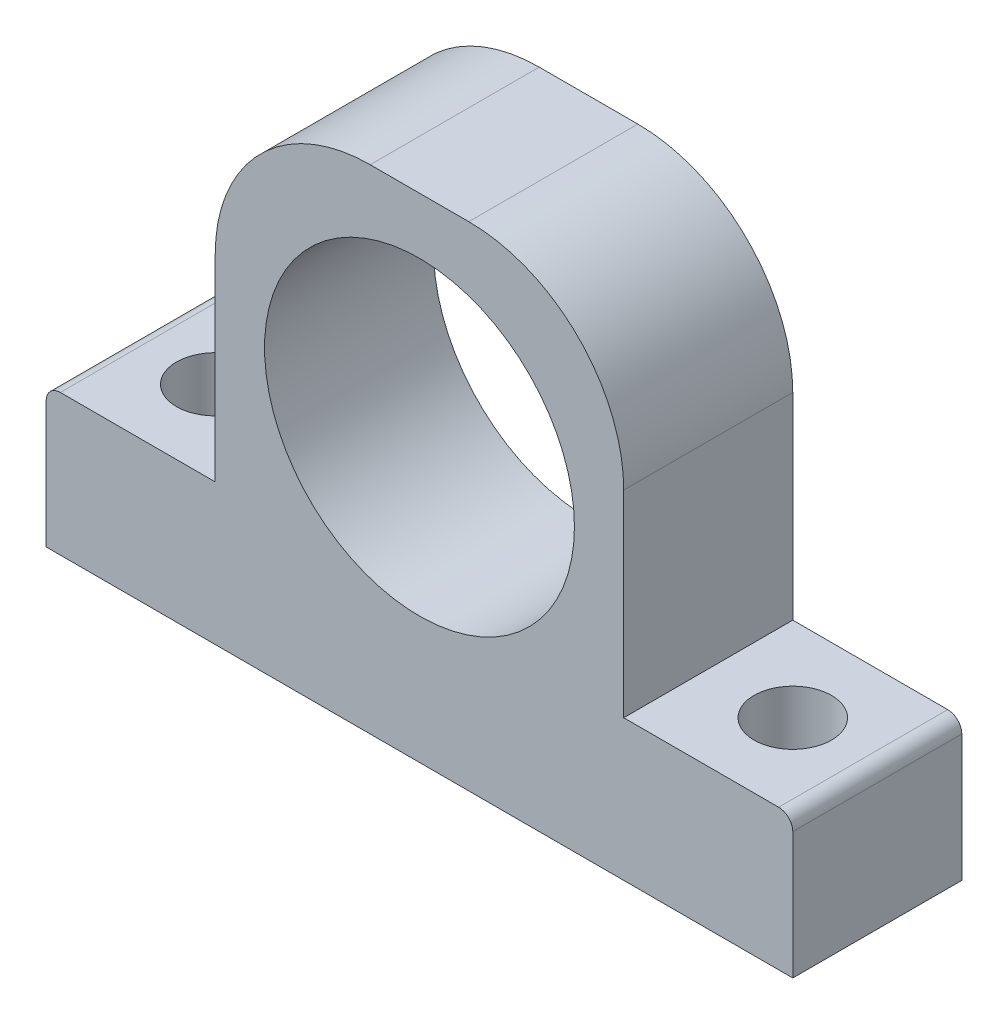
ISO-10303-21;
HEADER;
FILE_DESCRIPTION(('STEP AP214'),'2;1');
FILE_NAME('part.step','',(''),(''),'','','');
FILE_SCHEMA(('AUTOMOTIVE_DESIGN { 1 0 10303 214 1 1 1 1 }'));
ENDSEC;
DATA;
#1=APPLICATION_CONTEXT('core data for automotive mechanical design processes');
#2=APPLICATION_PROTOCOL_DEFINITION('international standard','automotive_design',2000,#1);
#3=PRODUCT_CONTEXT('',#1,'mechanical');
#4=PRODUCT('Part','Part','',(#3));
#5=PRODUCT_RELATED_PRODUCT_CATEGORY('part','',(#4));
#6=PRODUCT_DEFINITION_FORMATION('','',#4);
#7=PRODUCT_DEFINITION_CONTEXT('part definition',#1,'design');
#8=PRODUCT_DEFINITION('design','',#6,#7);
#9=PRODUCT_DEFINITION_SHAPE('','',#8);
#10=(LENGTH_UNIT() NAMED_UNIT(*) SI_UNIT(.MILLI.,.METRE.));
#11=(NAMED_UNIT(*) PLANE_ANGLE_UNIT() SI_UNIT($,.RADIAN.));
#12=(NAMED_UNIT(*) SI_UNIT($,.STERADIAN.) SOLID_ANGLE_UNIT());
#13=UNCERTAINTY_MEASURE_WITH_UNIT(LENGTH_MEASURE(1.E-05),#10,'distance_accuracy_value','');
#14=(GEOMETRIC_REPRESENTATION_CONTEXT(3) GLOBAL_UNCERTAINTY_ASSIGNED_CONTEXT((#13)) GLOBAL_UNIT_ASSIGNED_CONTEXT((#10,
#11,#12)) REPRESENTATION_CONTEXT('',''));
#15=CARTESIAN_POINT('',(0.,0.,0.));
#16=DIRECTION('',(0.,0.,1.));
#17=DIRECTION('',(1.,0.,0.));
#18=AXIS2_PLACEMENT_3D('',#15,#16,#17);
#19=CARTESIAN_POINT('',(-25.5,9.,12.));
#20=DIRECTION('',(0.,0.,1.));
#21=DIRECTION('',(1.,0.,0.));
#22=AXIS2_PLACEMENT_3D('',#19,#20,#21);
#23=PLANE('',#22);
#24=DIRECTION('',(0.,1.,0.));
#25=VECTOR('',#24,1.);
#26=CARTESIAN_POINT('',(26.5,9.,12.));
#27=LINE('',#26,#25);
#28=CARTESIAN_POINT('',(26.5,0.,12.));
#29=VERTEX_POINT('',#28);
#30=CARTESIAN_POINT('',(26.5,9.,12.));
#31=VERTEX_POINT('',#30);
#32=EDGE_CURVE('E185',#29,#31,#27,.T.);
#33=ORIENTED_EDGE('',*,*,#32,.T.);
#34=CARTESIAN_POINT('',(25.5,9.00000000000001,12.));
#35=DIRECTION('',(0.,0.,1.));
#36=DIRECTION('',(-1.,0.,0.));
#37=AXIS2_PLACEMENT_3D('',#34,#35,#36);
#38=CIRCLE('',#37,1.);
#39=CARTESIAN_POINT('',(25.5,10.,12.));
#40=VERTEX_POINT('',#39);
#41=EDGE_CURVE('E113',#31,#40,#38,.T.);
#42=ORIENTED_EDGE('',*,*,#41,.T.);
#43=DIRECTION('',(-1.,0.,0.));
#44=VECTOR('',#43,1.);
#45=CARTESIAN_POINT('',(14.5,10.,12.));
#46=LINE('',#45,#44);
#47=CARTESIAN_POINT('',(14.5,10.,12.));
#48=VERTEX_POINT('',#47);
#49=EDGE_CURVE('E212',#40,#48,#46,.T.);
#50=ORIENTED_EDGE('',*,*,#49,.T.);
#51=DIRECTION('',(0.,1.,0.));
#52=VECTOR('',#51,1.);
#53=CARTESIAN_POINT('',(14.5,23.9999999999999,12.));
#54=LINE('',#53,#52);
#55=CARTESIAN_POINT('',(14.5,23.9999999999999,12.));
#56=VERTEX_POINT('',#55);
#57=EDGE_CURVE('E231',#48,#56,#54,.T.);
#58=ORIENTED_EDGE('',*,*,#57,.T.);
#59=CARTESIAN_POINT('',(3.5,24.,12.));
#60=DIRECTION('',(0.,0.,1.));
#61=DIRECTION('',(-1.,0.,0.));
#62=AXIS2_PLACEMENT_3D('',#59,#60,#61);
#63=CIRCLE('',#62,11.);
#64=CARTESIAN_POINT('',(3.49999999999991,35.,12.));
#65=VERTEX_POINT('',#64);
#66=EDGE_CURVE('E228',#56,#65,#63,.T.);
#67=ORIENTED_EDGE('',*,*,#66,.T.);
#68=DIRECTION('',(-1.,0.,0.));
#69=VECTOR('',#68,1.);
#70=CARTESIAN_POINT('',(-3.49999999999993,35.,12.));
#71=LINE('',#70,#69);
#72=CARTESIAN_POINT('',(-3.49999999999993,35.,12.));
#73=VERTEX_POINT('',#72);
#74=EDGE_CURVE('E230',#65,#73,#71,.T.);
#75=ORIENTED_EDGE('',*,*,#74,.T.);
#76=CARTESIAN_POINT('',(-3.50000000000001,24.,12.));
#77=DIRECTION('',(0.,0.,1.));
#78=DIRECTION('',(1.,0.,0.));
#79=AXIS2_PLACEMENT_3D('',#76,#77,#78);
#80=CIRCLE('',#79,11.);
#81=CARTESIAN_POINT('',(-14.5,23.9999999999999,12.));
#82=VERTEX_POINT('',#81);
#83=EDGE_CURVE('E233',#73,#82,#80,.T.);
#84=ORIENTED_EDGE('',*,*,#83,.T.);
#85=DIRECTION('',(0.,-1.,0.));
#86=VECTOR('',#85,1.);
#87=CARTESIAN_POINT('',(-14.5,23.9999999999999,12.));
#88=LINE('',#87,#86);
#89=CARTESIAN_POINT('',(-14.5,10.,12.));
#90=VERTEX_POINT('',#89);
#91=EDGE_CURVE('E239',#82,#90,#88,.T.);
#92=ORIENTED_EDGE('',*,*,#91,.T.);
#93=DIRECTION('',(-1.,0.,0.));
#94=VECTOR('',#93,1.);
#95=CARTESIAN_POINT('',(-25.5,10.,12.));
#96=LINE('',#95,#94);
#97=CARTESIAN_POINT('',(-25.5,10.,12.));
#98=VERTEX_POINT('',#97);
#99=EDGE_CURVE('E144',#90,#98,#96,.T.);
#100=ORIENTED_EDGE('',*,*,#99,.T.);
#101=CARTESIAN_POINT('',(-25.5,9.,12.));
#102=DIRECTION('',(0.,0.,1.));
#103=DIRECTION('',(1.,0.,0.));
#104=AXIS2_PLACEMENT_3D('',#101,#102,#103);
#105=CIRCLE('',#104,1.);
#106=CARTESIAN_POINT('',(-26.5,8.99999999999999,12.));
#107=VERTEX_POINT('',#106);
#108=EDGE_CURVE('E138',#98,#107,#105,.T.);
#109=ORIENTED_EDGE('',*,*,#108,.T.);
#110=DIRECTION('',(0.,-1.,0.));
#111=VECTOR('',#110,1.);
#112=CARTESIAN_POINT('',(-26.5,8.99999999999999,12.));
#113=LINE('',#112,#111);
#114=CARTESIAN_POINT('',(-26.5,0.,12.));
#115=VERTEX_POINT('',#114);
#116=EDGE_CURVE('E142',#107,#115,#113,.T.);
#117=ORIENTED_EDGE('',*,*,#116,.T.);
#118=DIRECTION('',(1.,0.,0.));
#119=VECTOR('',#118,1.);
#120=CARTESIAN_POINT('',(-26.5,0.,12.));
#121=LINE('',#120,#119);
#122=EDGE_CURVE('E58',#115,#29,#121,.T.);
#123=ORIENTED_EDGE('',*,*,#122,.T.);
#124=EDGE_LOOP('',(#33,#42,#50,#58,#67,#75,#84,#92,#100,#109,#117,#123));
#125=FACE_BOUND('',#124,.T.);
#126=CARTESIAN_POINT('',(0.,20.,12.));
#127=DIRECTION('',(0.,0.,1.));
#128=DIRECTION('',(1.,0.,0.));
#129=AXIS2_PLACEMENT_3D('',#126,#127,#128);
#130=CIRCLE('',#129,11.);
#131=CARTESIAN_POINT('',(11.,20.,12.));
#132=VERTEX_POINT('',#131);
#133=EDGE_CURVE('E166',#132,#132,#130,.T.);
#134=ORIENTED_EDGE('',*,*,#133,.F.);
#135=EDGE_LOOP('',(#134));
#136=FACE_BOUND('',#135,.T.);
#137=ADVANCED_FACE('F41',(#125,#136),#23,.T.);
#138=CARTESIAN_POINT('',(-25.5,9.,0.));
#139=DIRECTION('',(0.,0.,1.));
#140=DIRECTION('',(1.,0.,0.));
#141=AXIS2_PLACEMENT_3D('',#138,#139,#140);
#142=PLANE('',#141);
#143=DIRECTION('',(0.,1.,0.));
#144=VECTOR('',#143,1.);
#145=CARTESIAN_POINT('',(26.5,9.,0.));
#146=LINE('',#145,#144);
#147=CARTESIAN_POINT('',(26.5,0.,0.));
#148=VERTEX_POINT('',#147);
#149=CARTESIAN_POINT('',(26.5,9.,0.));
#150=VERTEX_POINT('',#149);
#151=EDGE_CURVE('E162',#148,#150,#146,.T.);
#152=ORIENTED_EDGE('',*,*,#151,.F.);
#153=DIRECTION('',(1.,0.,0.));
#154=VECTOR('',#153,1.);
#155=CARTESIAN_POINT('',(-26.5,0.,0.));
#156=LINE('',#155,#154);
#157=CARTESIAN_POINT('',(-26.5,0.,0.));
#158=VERTEX_POINT('',#157);
#159=EDGE_CURVE('E105',#158,#148,#156,.T.);
#160=ORIENTED_EDGE('',*,*,#159,.F.);
#161=DIRECTION('',(0.,-1.,0.));
#162=VECTOR('',#161,1.);
#163=CARTESIAN_POINT('',(-26.5,8.99999999999999,0.));
#164=LINE('',#163,#162);
#165=CARTESIAN_POINT('',(-26.5,8.99999999999999,0.));
#166=VERTEX_POINT('',#165);
#167=EDGE_CURVE('E99',#166,#158,#164,.T.);
#168=ORIENTED_EDGE('',*,*,#167,.F.);
#169=CARTESIAN_POINT('',(-25.5,9.,0.));
#170=DIRECTION('',(0.,0.,1.));
#171=DIRECTION('',(1.,0.,0.));
#172=AXIS2_PLACEMENT_3D('',#169,#170,#171);
#173=CIRCLE('',#172,1.);
#174=CARTESIAN_POINT('',(-25.5,10.,0.));
#175=VERTEX_POINT('',#174);
#176=EDGE_CURVE('E152',#175,#166,#173,.T.);
#177=ORIENTED_EDGE('',*,*,#176,.F.);
#178=DIRECTION('',(-1.,0.,0.));
#179=VECTOR('',#178,1.);
#180=CARTESIAN_POINT('',(-25.5,10.,0.));
#181=LINE('',#180,#179);
#182=CARTESIAN_POINT('',(-14.5,10.,0.));
#183=VERTEX_POINT('',#182);
#184=EDGE_CURVE('E180',#183,#175,#181,.T.);
#185=ORIENTED_EDGE('',*,*,#184,.F.);
#186=DIRECTION('',(0.,-1.,0.));
#187=VECTOR('',#186,1.);
#188=CARTESIAN_POINT('',(-14.5,23.9999999999999,0.));
#189=LINE('',#188,#187);
#190=CARTESIAN_POINT('',(-14.5,23.9999999999999,0.));
#191=VERTEX_POINT('',#190);
#192=EDGE_CURVE('E178',#191,#183,#189,.T.);
#193=ORIENTED_EDGE('',*,*,#192,.F.);
#194=CARTESIAN_POINT('',(-3.50000000000001,24.,0.));
#195=DIRECTION('',(0.,0.,1.));
#196=DIRECTION('',(1.,0.,0.));
#197=AXIS2_PLACEMENT_3D('',#194,#195,#196);
#198=CIRCLE('',#197,11.);
#199=CARTESIAN_POINT('',(-3.49999999999993,35.,0.));
#200=VERTEX_POINT('',#199);
#201=EDGE_CURVE('E176',#200,#191,#198,.T.);
#202=ORIENTED_EDGE('',*,*,#201,.F.);
#203=DIRECTION('',(-1.,0.,0.));
#204=VECTOR('',#203,1.);
#205=CARTESIAN_POINT('',(-3.49999999999993,35.,0.));
#206=LINE('',#205,#204);
#207=CARTESIAN_POINT('',(3.49999999999991,35.,0.));
#208=VERTEX_POINT('',#207);
#209=EDGE_CURVE('E174',#208,#200,#206,.T.);
#210=ORIENTED_EDGE('',*,*,#209,.F.);
#211=CARTESIAN_POINT('',(3.5,24.,0.));
#212=DIRECTION('',(0.,0.,1.));
#213=DIRECTION('',(-1.,0.,0.));
#214=AXIS2_PLACEMENT_3D('',#211,#212,#213);
#215=CIRCLE('',#214,11.);
#216=CARTESIAN_POINT('',(14.5,23.9999999999999,0.));
#217=VERTEX_POINT('',#216);
#218=EDGE_CURVE('E172',#217,#208,#215,.T.);
#219=ORIENTED_EDGE('',*,*,#218,.F.);
#220=DIRECTION('',(0.,1.,0.));
#221=VECTOR('',#220,1.);
#222=CARTESIAN_POINT('',(14.5,23.9999999999999,0.));
#223=LINE('',#222,#221);
#224=CARTESIAN_POINT('',(14.5,10.,0.));
#225=VERTEX_POINT('',#224);
#226=EDGE_CURVE('E170',#225,#217,#223,.T.);
#227=ORIENTED_EDGE('',*,*,#226,.F.);
#228=DIRECTION('',(-1.,0.,0.));
#229=VECTOR('',#228,1.);
#230=CARTESIAN_POINT('',(14.5,10.,0.));
#231=LINE('',#230,#229);
#232=CARTESIAN_POINT('',(25.5,10.,0.));
#233=VERTEX_POINT('',#232);
#234=EDGE_CURVE('E168',#233,#225,#231,.T.);
#235=ORIENTED_EDGE('',*,*,#234,.F.);
#236=CARTESIAN_POINT('',(25.5,9.00000000000001,0.));
#237=DIRECTION('',(0.,0.,1.));
#238=DIRECTION('',(-1.,0.,0.));
#239=AXIS2_PLACEMENT_3D('',#236,#237,#238);
#240=CIRCLE('',#239,1.);
#241=EDGE_CURVE('E165',#150,#233,#240,.T.);
#242=ORIENTED_EDGE('',*,*,#241,.F.);
#243=EDGE_LOOP('',(#152,#160,#168,#177,#185,#193,#202,#210,#219,#227,#235,#242));
#244=FACE_BOUND('',#243,.T.);
#245=CARTESIAN_POINT('',(0.,20.,0.));
#246=DIRECTION('',(0.,0.,1.));
#247=DIRECTION('',(1.,0.,0.));
#248=AXIS2_PLACEMENT_3D('',#245,#246,#247);
#249=CIRCLE('',#248,11.);
#250=CARTESIAN_POINT('',(11.,20.,0.));
#251=VERTEX_POINT('',#250);
#252=EDGE_CURVE('E293',#251,#251,#249,.T.);
#253=ORIENTED_EDGE('',*,*,#252,.T.);
#254=EDGE_LOOP('',(#253));
#255=FACE_BOUND('',#254,.T.);
#256=ADVANCED_FACE('F216',(#244,#255),#142,.F.);
#257=CARTESIAN_POINT('',(26.5,9.,12.));
#258=DIRECTION('',(-1.,0.,0.));
#259=DIRECTION('',(0.,0.,1.));
#260=AXIS2_PLACEMENT_3D('',#257,#258,#259);
#261=PLANE('',#260);
#262=ORIENTED_EDGE('',*,*,#151,.T.);
#263=DIRECTION('',(0.,0.,-1.));
#264=VECTOR('',#263,1.);
#265=CARTESIAN_POINT('',(26.5,9.,12.));
#266=LINE('',#265,#264);
#267=EDGE_CURVE('E11',#31,#150,#266,.T.);
#268=ORIENTED_EDGE('',*,*,#267,.F.);
#269=ORIENTED_EDGE('',*,*,#32,.F.);
#270=DIRECTION('',(0.,0.,-1.));
#271=VECTOR('',#270,1.);
#272=CARTESIAN_POINT('',(26.5,0.,12.));
#273=LINE('',#272,#271);
#274=EDGE_CURVE('E158',#29,#148,#273,.T.);
#275=ORIENTED_EDGE('',*,*,#274,.T.);
#276=EDGE_LOOP('',(#262,#268,#269,#275));
#277=FACE_BOUND('',#276,.T.);
#278=ADVANCED_FACE('F43',(#277),#261,.F.);
#279=CARTESIAN_POINT('',(25.5,9.00000000000001,12.));
#280=DIRECTION('',(0.,0.,-1.));
#281=DIRECTION('',(-1.,0.,0.));
#282=AXIS2_PLACEMENT_3D('',#279,#280,#281);
#283=CYLINDRICAL_SURFACE('',#282,1.);
#284=ORIENTED_EDGE('',*,*,#241,.T.);
#285=DIRECTION('',(0.,0.,-1.));
#286=VECTOR('',#285,1.);
#287=CARTESIAN_POINT('',(25.5,10.,12.));
#288=LINE('',#287,#286);
#289=EDGE_CURVE('E50',#40,#233,#288,.T.);
#290=ORIENTED_EDGE('',*,*,#289,.F.);
#291=ORIENTED_EDGE('',*,*,#41,.F.);
#292=ORIENTED_EDGE('',*,*,#267,.T.);
#293=EDGE_LOOP('',(#284,#290,#291,#292));
#294=FACE_BOUND('',#293,.T.);
#295=ADVANCED_FACE('F314',(#294),#283,.T.);
#296=CARTESIAN_POINT('',(14.5,10.,12.));
#297=DIRECTION('',(0.,-1.,0.));
#298=DIRECTION('',(1.,0.,0.));
#299=AXIS2_PLACEMENT_3D('',#296,#297,#298);
#300=PLANE('',#299);
#301=CARTESIAN_POINT('',(20.5,10.,6.));
#302=DIRECTION('',(0.,1.,0.));
#303=DIRECTION('',(1.,0.,0.));
#304=AXIS2_PLACEMENT_3D('',#301,#302,#303);
#305=CIRCLE('',#304,2.75);
#306=CARTESIAN_POINT('',(23.25,10.,6.));
#307=VERTEX_POINT('',#306);
#308=EDGE_CURVE('E291',#307,#307,#305,.T.);
#309=ORIENTED_EDGE('',*,*,#308,.F.);
#310=EDGE_LOOP('',(#309));
#311=FACE_BOUND('',#310,.T.);
#312=ORIENTED_EDGE('',*,*,#234,.T.);
#313=DIRECTION('',(0.,0.,-1.));
#314=VECTOR('',#313,1.);
#315=CARTESIAN_POINT('',(14.5,10.,12.));
#316=LINE('',#315,#314);
#317=EDGE_CURVE('E204',#48,#225,#316,.T.);
#318=ORIENTED_EDGE('',*,*,#317,.F.);
#319=ORIENTED_EDGE('',*,*,#49,.F.);
#320=ORIENTED_EDGE('',*,*,#289,.T.);
#321=EDGE_LOOP('',(#312,#318,#319,#320));
#322=FACE_BOUND('',#321,.T.);
#323=ADVANCED_FACE('F210',(#311,#322),#300,.F.);
#324=CARTESIAN_POINT('',(14.5,23.9999999999999,12.));
#325=DIRECTION('',(-1.,0.,0.));
#326=DIRECTION('',(0.,-1.,0.));
#327=AXIS2_PLACEMENT_3D('',#324,#325,#326);
#328=PLANE('',#327);
#329=ORIENTED_EDGE('',*,*,#226,.T.);
#330=DIRECTION('',(0.,0.,-1.));
#331=VECTOR('',#330,1.);
#332=CARTESIAN_POINT('',(14.5,23.9999999999999,12.));
#333=LINE('',#332,#331);
#334=EDGE_CURVE('E201',#56,#217,#333,.T.);
#335=ORIENTED_EDGE('',*,*,#334,.F.);
#336=ORIENTED_EDGE('',*,*,#57,.F.);
#337=ORIENTED_EDGE('',*,*,#317,.T.);
#338=EDGE_LOOP('',(#329,#335,#336,#337));
#339=FACE_BOUND('',#338,.T.);
#340=ADVANCED_FACE('F222',(#339),#328,.F.);
#341=CARTESIAN_POINT('',(3.5,24.,12.));
#342=DIRECTION('',(0.,0.,-1.));
#343=DIRECTION('',(-1.,0.,0.));
#344=AXIS2_PLACEMENT_3D('',#341,#342,#343);
#345=CYLINDRICAL_SURFACE('',#344,11.);
#346=ORIENTED_EDGE('',*,*,#218,.T.);
#347=DIRECTION('',(0.,0.,-1.));
#348=VECTOR('',#347,1.);
#349=CARTESIAN_POINT('',(3.49999999999991,35.,12.));
#350=LINE('',#349,#348);
#351=EDGE_CURVE('E198',#65,#208,#350,.T.);
#352=ORIENTED_EDGE('',*,*,#351,.F.);
#353=ORIENTED_EDGE('',*,*,#66,.F.);
#354=ORIENTED_EDGE('',*,*,#334,.T.);
#355=EDGE_LOOP('',(#346,#352,#353,#354));
#356=FACE_BOUND('',#355,.T.);
#357=ADVANCED_FACE('F226',(#356),#345,.T.);
#358=CARTESIAN_POINT('',(-3.49999999999993,35.,12.));
#359=DIRECTION('',(0.,-1.,0.));
#360=DIRECTION('',(0.,0.,-1.));
#361=AXIS2_PLACEMENT_3D('',#358,#359,#360);
#362=PLANE('',#361);
#363=ORIENTED_EDGE('',*,*,#209,.T.);
#364=DIRECTION('',(0.,0.,-1.));
#365=VECTOR('',#364,1.);
#366=CARTESIAN_POINT('',(-3.49999999999993,35.,12.));
#367=LINE('',#366,#365);
#368=EDGE_CURVE('E195',#73,#200,#367,.T.);
#369=ORIENTED_EDGE('',*,*,#368,.F.);
#370=ORIENTED_EDGE('',*,*,#74,.F.);
#371=ORIENTED_EDGE('',*,*,#351,.T.);
#372=EDGE_LOOP('',(#363,#369,#370,#371));
#373=FACE_BOUND('',#372,.T.);
#374=ADVANCED_FACE('F324',(#373),#362,.F.);
#375=CARTESIAN_POINT('',(-3.50000000000001,24.,12.));
#376=DIRECTION('',(0.,0.,-1.));
#377=DIRECTION('',(-1.,0.,0.));
#378=AXIS2_PLACEMENT_3D('',#375,#376,#377);
#379=CYLINDRICAL_SURFACE('',#378,11.);
#380=ORIENTED_EDGE('',*,*,#201,.T.);
#381=DIRECTION('',(0.,0.,-1.));
#382=VECTOR('',#381,1.);
#383=CARTESIAN_POINT('',(-14.5,23.9999999999999,12.));
#384=LINE('',#383,#382);
#385=EDGE_CURVE('E192',#82,#191,#384,.T.);
#386=ORIENTED_EDGE('',*,*,#385,.F.);
#387=ORIENTED_EDGE('',*,*,#83,.F.);
#388=ORIENTED_EDGE('',*,*,#368,.T.);
#389=EDGE_LOOP('',(#380,#386,#387,#388));
#390=FACE_BOUND('',#389,.T.);
#391=ADVANCED_FACE('F327',(#390),#379,.T.);
#392=CARTESIAN_POINT('',(-14.5,23.9999999999999,12.));
#393=DIRECTION('',(1.,0.,0.));
#394=DIRECTION('',(0.,1.,0.));
#395=AXIS2_PLACEMENT_3D('',#392,#393,#394);
#396=PLANE('',#395);
#397=ORIENTED_EDGE('',*,*,#192,.T.);
#398=DIRECTION('',(0.,0.,-1.));
#399=VECTOR('',#398,1.);
#400=CARTESIAN_POINT('',(-14.5,10.,12.));
#401=LINE('',#400,#399);
#402=EDGE_CURVE('E189',#90,#183,#401,.T.);
#403=ORIENTED_EDGE('',*,*,#402,.F.);
#404=ORIENTED_EDGE('',*,*,#91,.F.);
#405=ORIENTED_EDGE('',*,*,#385,.T.);
#406=EDGE_LOOP('',(#397,#403,#404,#405));
#407=FACE_BOUND('',#406,.T.);
#408=ADVANCED_FACE('F245',(#407),#396,.F.);
#409=CARTESIAN_POINT('',(-25.5,10.,12.));
#410=DIRECTION('',(0.,-1.,0.));
#411=DIRECTION('',(1.,0.,0.));
#412=AXIS2_PLACEMENT_3D('',#409,#410,#411);
#413=PLANE('',#412);
#414=CARTESIAN_POINT('',(-20.5,10.,6.));
#415=DIRECTION('',(0.,1.,0.));
#416=DIRECTION('',(-1.,0.,0.));
#417=AXIS2_PLACEMENT_3D('',#414,#415,#416);
#418=CIRCLE('',#417,2.75);
#419=CARTESIAN_POINT('',(-23.25,10.,6.));
#420=VERTEX_POINT('',#419);
#421=EDGE_CURVE('E289',#420,#420,#418,.T.);
#422=ORIENTED_EDGE('',*,*,#421,.F.);
#423=EDGE_LOOP('',(#422));
#424=FACE_BOUND('',#423,.T.);
#425=ORIENTED_EDGE('',*,*,#184,.T.);
#426=DIRECTION('',(0.,0.,-1.));
#427=VECTOR('',#426,1.);
#428=CARTESIAN_POINT('',(-25.5,10.,12.));
#429=LINE('',#428,#427);
#430=EDGE_CURVE('E153',#98,#175,#429,.T.);
#431=ORIENTED_EDGE('',*,*,#430,.F.);
#432=ORIENTED_EDGE('',*,*,#99,.F.);
#433=ORIENTED_EDGE('',*,*,#402,.T.);
#434=EDGE_LOOP('',(#425,#431,#432,#433));
#435=FACE_BOUND('',#434,.T.);
#436=ADVANCED_FACE('F249',(#424,#435),#413,.F.);
#437=CARTESIAN_POINT('',(-25.5,9.,12.));
#438=DIRECTION('',(0.,0.,-1.));
#439=DIRECTION('',(-1.,0.,0.));
#440=AXIS2_PLACEMENT_3D('',#437,#438,#439);
#441=CYLINDRICAL_SURFACE('',#440,1.);
#442=ORIENTED_EDGE('',*,*,#176,.T.);
#443=DIRECTION('',(0.,0.,-1.));
#444=VECTOR('',#443,1.);
#445=CARTESIAN_POINT('',(-26.5,8.99999999999999,12.));
#446=LINE('',#445,#444);
#447=EDGE_CURVE('E149',#107,#166,#446,.T.);
#448=ORIENTED_EDGE('',*,*,#447,.F.);
#449=ORIENTED_EDGE('',*,*,#108,.F.);
#450=ORIENTED_EDGE('',*,*,#430,.T.);
#451=EDGE_LOOP('',(#442,#448,#449,#450));
#452=FACE_BOUND('',#451,.T.);
#453=ADVANCED_FACE('F150',(#452),#441,.T.);
#454=CARTESIAN_POINT('',(-26.5,8.99999999999999,12.));
#455=DIRECTION('',(1.,0.,0.));
#456=DIRECTION('',(0.,1.,0.));
#457=AXIS2_PLACEMENT_3D('',#454,#455,#456);
#458=PLANE('',#457);
#459=ORIENTED_EDGE('',*,*,#167,.T.);
#460=DIRECTION('',(0.,0.,-1.));
#461=VECTOR('',#460,1.);
#462=CARTESIAN_POINT('',(-26.5,0.,12.));
#463=LINE('',#462,#461);
#464=EDGE_CURVE('E154',#115,#158,#463,.T.);
#465=ORIENTED_EDGE('',*,*,#464,.F.);
#466=ORIENTED_EDGE('',*,*,#116,.F.);
#467=ORIENTED_EDGE('',*,*,#447,.T.);
#468=EDGE_LOOP('',(#459,#465,#466,#467));
#469=FACE_BOUND('',#468,.T.);
#470=ADVANCED_FACE('F156',(#469),#458,.F.);
#471=CARTESIAN_POINT('',(-26.5,0.,12.));
#472=DIRECTION('',(0.,1.,0.));
#473=DIRECTION('',(-1.,0.,0.));
#474=AXIS2_PLACEMENT_3D('',#471,#472,#473);
#475=PLANE('',#474);
#476=CARTESIAN_POINT('',(-20.5,0.,6.));
#477=DIRECTION('',(0.,1.,0.));
#478=DIRECTION('',(-1.,0.,0.));
#479=AXIS2_PLACEMENT_3D('',#476,#477,#478);
#480=CIRCLE('',#479,2.75);
#481=CARTESIAN_POINT('',(-23.25,0.,6.));
#482=VERTEX_POINT('',#481);
#483=EDGE_CURVE('E286',#482,#482,#480,.T.);
#484=ORIENTED_EDGE('',*,*,#483,.T.);
#485=EDGE_LOOP('',(#484));
#486=FACE_BOUND('',#485,.T.);
#487=CARTESIAN_POINT('',(20.5,0.,6.));
#488=DIRECTION('',(0.,1.,0.));
#489=DIRECTION('',(1.,0.,0.));
#490=AXIS2_PLACEMENT_3D('',#487,#488,#489);
#491=CIRCLE('',#490,2.75);
#492=CARTESIAN_POINT('',(23.25,0.,6.));
#493=VERTEX_POINT('',#492);
#494=EDGE_CURVE('E296',#493,#493,#491,.T.);
#495=ORIENTED_EDGE('',*,*,#494,.T.);
#496=EDGE_LOOP('',(#495));
#497=FACE_BOUND('',#496,.T.);
#498=ORIENTED_EDGE('',*,*,#159,.T.);
#499=ORIENTED_EDGE('',*,*,#274,.F.);
#500=ORIENTED_EDGE('',*,*,#122,.F.);
#501=ORIENTED_EDGE('',*,*,#464,.T.);
#502=EDGE_LOOP('',(#498,#499,#500,#501));
#503=FACE_BOUND('',#502,.T.);
#504=ADVANCED_FACE('F253',(#486,#497,#503),#475,.F.);
#505=CARTESIAN_POINT('',(0.,20.,12.));
#506=DIRECTION('',(0.,0.,-1.));
#507=DIRECTION('',(-1.,0.,0.));
#508=AXIS2_PLACEMENT_3D('',#505,#506,#507);
#509=CYLINDRICAL_SURFACE('',#508,11.);
#510=ORIENTED_EDGE('',*,*,#133,.T.);
#511=EDGE_LOOP('',(#510));
#512=FACE_BOUND('',#511,.T.);
#513=ORIENTED_EDGE('',*,*,#252,.F.);
#514=EDGE_LOOP('',(#513));
#515=FACE_BOUND('',#514,.T.);
#516=ADVANCED_FACE('F255',(#512,#515),#509,.F.);
#517=CARTESIAN_POINT('',(20.5,0.,6.));
#518=DIRECTION('',(0.,1.,0.));
#519=DIRECTION('',(-1.,0.,0.));
#520=AXIS2_PLACEMENT_3D('',#517,#518,#519);
#521=CYLINDRICAL_SURFACE('',#520,2.75);
#522=ORIENTED_EDGE('',*,*,#494,.F.);
#523=EDGE_LOOP('',(#522));
#524=FACE_BOUND('',#523,.T.);
#525=ORIENTED_EDGE('',*,*,#308,.T.);
#526=EDGE_LOOP('',(#525));
#527=FACE_BOUND('',#526,.T.);
#528=ADVANCED_FACE('F263',(#524,#527),#521,.F.);
#529=CARTESIAN_POINT('',(-20.5,0.,6.));
#530=DIRECTION('',(0.,1.,0.));
#531=DIRECTION('',(-1.,0.,0.));
#532=AXIS2_PLACEMENT_3D('',#529,#530,#531);
#533=CYLINDRICAL_SURFACE('',#532,2.75);
#534=ORIENTED_EDGE('',*,*,#483,.F.);
#535=EDGE_LOOP('',(#534));
#536=FACE_BOUND('',#535,.T.);
#537=ORIENTED_EDGE('',*,*,#421,.T.);
#538=EDGE_LOOP('',(#537));
#539=FACE_BOUND('',#538,.T.);
#540=ADVANCED_FACE('F278',(#536,#539),#533,.F.);
#541=CLOSED_SHELL('',(#137,#256,#278,#295,#323,#340,#357,#374,#391,#408,#436,#453,#470,#504,
#516,#528,#540));
#542=MANIFOLD_SOLID_BREP('B2',#541);
#543=ADVANCED_BREP_SHAPE_REPRESENTATION('',(#18,#542),#14);
#544=SHAPE_DEFINITION_REPRESENTATION(#9,#543);
ENDSEC;
END-ISO-10303-21;
